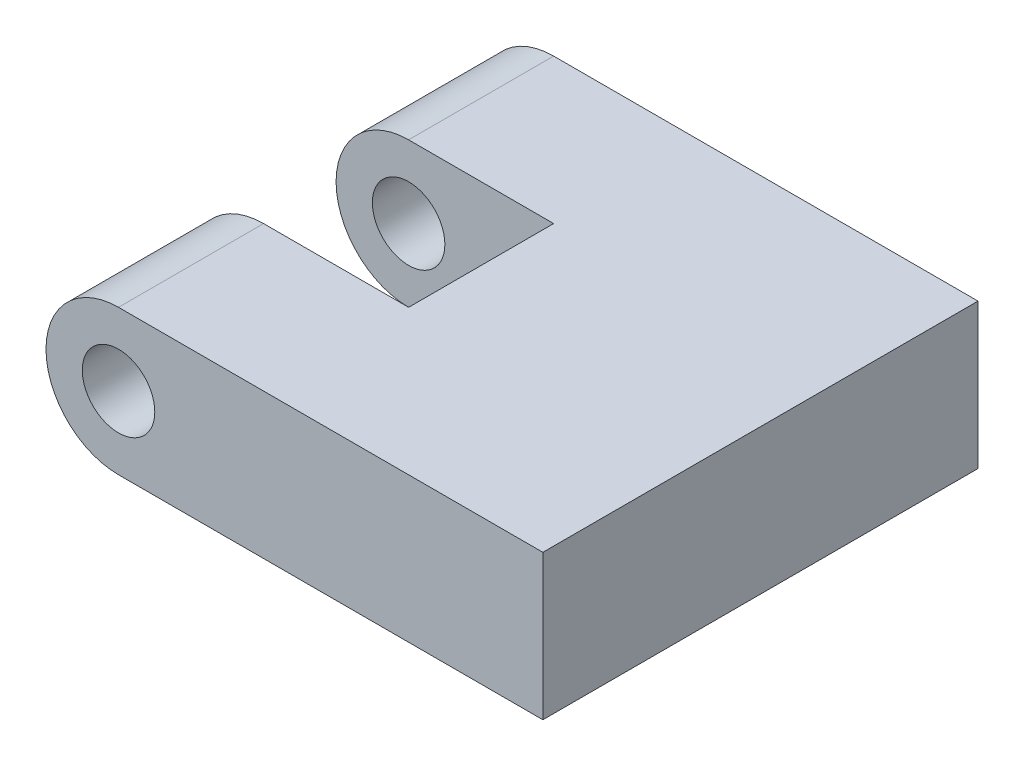
ISO-10303-21;
HEADER;
FILE_DESCRIPTION(('STEP AP214'),'2;1');
FILE_NAME('part.step','',(''),(''),'','','');
FILE_SCHEMA(('AUTOMOTIVE_DESIGN { 1 0 10303 214 1 1 1 1 }'));
ENDSEC;
DATA;
#1=APPLICATION_CONTEXT('core data for automotive mechanical design processes');
#2=APPLICATION_PROTOCOL_DEFINITION('international standard','automotive_design',2000,#1);
#3=PRODUCT_CONTEXT('',#1,'mechanical');
#4=PRODUCT('Part','Part','',(#3));
#5=PRODUCT_RELATED_PRODUCT_CATEGORY('part','',(#4));
#6=PRODUCT_DEFINITION_FORMATION('','',#4);
#7=PRODUCT_DEFINITION_CONTEXT('part definition',#1,'design');
#8=PRODUCT_DEFINITION('design','',#6,#7);
#9=PRODUCT_DEFINITION_SHAPE('','',#8);
#10=(LENGTH_UNIT() NAMED_UNIT(*) SI_UNIT(.MILLI.,.METRE.));
#11=(NAMED_UNIT(*) PLANE_ANGLE_UNIT() SI_UNIT($,.RADIAN.));
#12=(NAMED_UNIT(*) SI_UNIT($,.STERADIAN.) SOLID_ANGLE_UNIT());
#13=UNCERTAINTY_MEASURE_WITH_UNIT(LENGTH_MEASURE(1.E-05),#10,'distance_accuracy_value','');
#14=(GEOMETRIC_REPRESENTATION_CONTEXT(3) GLOBAL_UNCERTAINTY_ASSIGNED_CONTEXT((#13)) GLOBAL_UNIT_ASSIGNED_CONTEXT((#10,
#11,#12)) REPRESENTATION_CONTEXT('',''));
#15=CARTESIAN_POINT('',(0.,0.,0.));
#16=DIRECTION('',(0.,0.,1.));
#17=DIRECTION('',(1.,0.,0.));
#18=AXIS2_PLACEMENT_3D('',#15,#16,#17);
#19=CARTESIAN_POINT('',(0.,10.,60.));
#20=DIRECTION('',(0.,1.,0.));
#21=DIRECTION('',(0.,0.,1.));
#22=AXIS2_PLACEMENT_3D('',#19,#20,#21);
#23=PLANE('',#22);
#24=DIRECTION('',(0.,0.,1.));
#25=VECTOR('',#24,1.);
#26=CARTESIAN_POINT('',(20.,10.,60.));
#27=LINE('',#26,#25);
#28=CARTESIAN_POINT('',(20.,10.,20.));
#29=VERTEX_POINT('',#28);
#30=CARTESIAN_POINT('',(20.,10.,40.));
#31=VERTEX_POINT('',#30);
#32=EDGE_CURVE('E137',#29,#31,#27,.T.);
#33=ORIENTED_EDGE('',*,*,#32,.T.);
#34=DIRECTION('',(-1.,0.,0.));
#35=VECTOR('',#34,1.);
#36=CARTESIAN_POINT('',(0.,10.,40.));
#37=LINE('',#36,#35);
#38=CARTESIAN_POINT('',(0.,10.,40.));
#39=VERTEX_POINT('',#38);
#40=EDGE_CURVE('E134',#31,#39,#37,.T.);
#41=ORIENTED_EDGE('',*,*,#40,.T.);
#42=DIRECTION('',(0.,0.,-1.));
#43=VECTOR('',#42,1.);
#44=CARTESIAN_POINT('',(0.,10.,60.));
#45=LINE('',#44,#43);
#46=CARTESIAN_POINT('',(0.,10.,60.));
#47=VERTEX_POINT('',#46);
#48=EDGE_CURVE('E112',#47,#39,#45,.T.);
#49=ORIENTED_EDGE('',*,*,#48,.F.);
#50=DIRECTION('',(1.,0.,0.));
#51=VECTOR('',#50,1.);
#52=CARTESIAN_POINT('',(0.,10.,60.));
#53=LINE('',#52,#51);
#54=CARTESIAN_POINT('',(58.512258846341,10.,60.));
#55=VERTEX_POINT('',#54);
#56=EDGE_CURVE('E106',#47,#55,#53,.T.);
#57=ORIENTED_EDGE('',*,*,#56,.T.);
#58=DIRECTION('',(0.,0.,1.));
#59=VECTOR('',#58,1.);
#60=CARTESIAN_POINT('',(58.512258846341,10.,0.));
#61=LINE('',#60,#59);
#62=CARTESIAN_POINT('',(58.512258846341,10.,0.));
#63=VERTEX_POINT('',#62);
#64=EDGE_CURVE('E165',#63,#55,#61,.T.);
#65=ORIENTED_EDGE('',*,*,#64,.F.);
#66=DIRECTION('',(1.,0.,0.));
#67=VECTOR('',#66,1.);
#68=CARTESIAN_POINT('',(0.,10.,0.));
#69=LINE('',#68,#67);
#70=CARTESIAN_POINT('',(0.,10.,0.));
#71=VERTEX_POINT('',#70);
#72=EDGE_CURVE('E100',#71,#63,#69,.T.);
#73=ORIENTED_EDGE('',*,*,#72,.F.);
#74=CARTESIAN_POINT('',(0.,10.,20.));
#75=VERTEX_POINT('',#74);
#76=EDGE_CURVE('E96',#75,#71,#45,.T.);
#77=ORIENTED_EDGE('',*,*,#76,.F.);
#78=DIRECTION('',(1.,0.,0.));
#79=VECTOR('',#78,1.);
#80=CARTESIAN_POINT('',(0.,10.,20.));
#81=LINE('',#80,#79);
#82=EDGE_CURVE('E148',#75,#29,#81,.T.);
#83=ORIENTED_EDGE('',*,*,#82,.T.);
#84=EDGE_LOOP('',(#33,#41,#49,#57,#65,#73,#77,#83));
#85=FACE_BOUND('',#84,.T.);
#86=ADVANCED_FACE('F37',(#85),#23,.T.);
#87=CARTESIAN_POINT('',(0.,0.,60.));
#88=DIRECTION('',(0.,0.,-1.));
#89=DIRECTION('',(-1.,0.,0.));
#90=AXIS2_PLACEMENT_3D('',#87,#88,#89);
#91=CYLINDRICAL_SURFACE('',#90,10.);
#92=CARTESIAN_POINT('',(0.,0.,40.));
#93=DIRECTION('',(0.,0.,-1.));
#94=DIRECTION('',(0.,1.,0.));
#95=AXIS2_PLACEMENT_3D('',#92,#93,#94);
#96=CIRCLE('',#95,10.);
#97=CARTESIAN_POINT('',(0.,-10.,40.));
#98=VERTEX_POINT('',#97);
#99=EDGE_CURVE('E151',#98,#39,#96,.T.);
#100=ORIENTED_EDGE('',*,*,#99,.F.);
#101=DIRECTION('',(0.,0.,-1.));
#102=VECTOR('',#101,1.);
#103=CARTESIAN_POINT('',(0.,-10.,60.));
#104=LINE('',#103,#102);
#105=CARTESIAN_POINT('',(0.,-10.,60.));
#106=VERTEX_POINT('',#105);
#107=EDGE_CURVE('E89',#106,#98,#104,.T.);
#108=ORIENTED_EDGE('',*,*,#107,.F.);
#109=CARTESIAN_POINT('',(0.,0.,60.));
#110=DIRECTION('',(0.,0.,1.));
#111=DIRECTION('',(1.,0.,0.));
#112=AXIS2_PLACEMENT_3D('',#109,#110,#111);
#113=CIRCLE('',#112,10.);
#114=EDGE_CURVE('E61',#47,#106,#113,.T.);
#115=ORIENTED_EDGE('',*,*,#114,.F.);
#116=ORIENTED_EDGE('',*,*,#48,.T.);
#117=EDGE_LOOP('',(#100,#108,#115,#116));
#118=FACE_BOUND('',#117,.T.);
#119=ADVANCED_FACE('F197',(#118),#91,.T.);
#120=CARTESIAN_POINT('',(0.,0.,20.));
#121=DIRECTION('',(0.,0.,1.));
#122=DIRECTION('',(0.,-1.,0.));
#123=AXIS2_PLACEMENT_3D('',#120,#121,#122);
#124=CIRCLE('',#123,10.);
#125=CARTESIAN_POINT('',(0.,-10.,20.));
#126=VERTEX_POINT('',#125);
#127=EDGE_CURVE('E145',#75,#126,#124,.T.);
#128=ORIENTED_EDGE('',*,*,#127,.F.);
#129=ORIENTED_EDGE('',*,*,#76,.T.);
#130=CARTESIAN_POINT('',(0.,0.,0.));
#131=DIRECTION('',(0.,0.,1.));
#132=DIRECTION('',(1.,0.,0.));
#133=AXIS2_PLACEMENT_3D('',#130,#131,#132);
#134=CIRCLE('',#133,10.);
#135=CARTESIAN_POINT('',(0.,-10.,0.));
#136=VERTEX_POINT('',#135);
#137=EDGE_CURVE('E93',#71,#136,#134,.T.);
#138=ORIENTED_EDGE('',*,*,#137,.T.);
#139=EDGE_CURVE('E76',#126,#136,#104,.T.);
#140=ORIENTED_EDGE('',*,*,#139,.F.);
#141=EDGE_LOOP('',(#128,#129,#138,#140));
#142=FACE_BOUND('',#141,.T.);
#143=ADVANCED_FACE('F94',(#142),#91,.T.);
#144=CARTESIAN_POINT('',(0.,-10.,60.));
#145=DIRECTION('',(0.,-1.,0.));
#146=DIRECTION('',(0.,0.,-1.));
#147=AXIS2_PLACEMENT_3D('',#144,#145,#146);
#148=PLANE('',#147);
#149=ORIENTED_EDGE('',*,*,#107,.T.);
#150=DIRECTION('',(1.,0.,0.));
#151=VECTOR('',#150,1.);
#152=CARTESIAN_POINT('',(0.,-10.,40.));
#153=LINE('',#152,#151);
#154=CARTESIAN_POINT('',(20.,-9.99999999999999,40.));
#155=VERTEX_POINT('',#154);
#156=EDGE_CURVE('E11',#98,#155,#153,.T.);
#157=ORIENTED_EDGE('',*,*,#156,.T.);
#158=DIRECTION('',(0.,0.,-1.));
#159=VECTOR('',#158,1.);
#160=CARTESIAN_POINT('',(20.,-10.,60.));
#161=LINE('',#160,#159);
#162=CARTESIAN_POINT('',(20.,-10.,20.));
#163=VERTEX_POINT('',#162);
#164=EDGE_CURVE('E115',#155,#163,#161,.T.);
#165=ORIENTED_EDGE('',*,*,#164,.T.);
#166=DIRECTION('',(-1.,0.,0.));
#167=VECTOR('',#166,1.);
#168=CARTESIAN_POINT('',(0.,-10.,20.));
#169=LINE('',#168,#167);
#170=EDGE_CURVE('E45',#163,#126,#169,.T.);
#171=ORIENTED_EDGE('',*,*,#170,.T.);
#172=ORIENTED_EDGE('',*,*,#139,.T.);
#173=DIRECTION('',(-1.,0.,0.));
#174=VECTOR('',#173,1.);
#175=CARTESIAN_POINT('',(0.,-10.,0.));
#176=LINE('',#175,#174);
#177=CARTESIAN_POINT('',(58.512258846341,-10.,0.));
#178=VERTEX_POINT('',#177);
#179=EDGE_CURVE('E83',#178,#136,#176,.T.);
#180=ORIENTED_EDGE('',*,*,#179,.F.);
#181=DIRECTION('',(0.,0.,-1.));
#182=VECTOR('',#181,1.);
#183=CARTESIAN_POINT('',(58.512258846341,-10.,60.));
#184=LINE('',#183,#182);
#185=CARTESIAN_POINT('',(58.512258846341,-10.,60.));
#186=VERTEX_POINT('',#185);
#187=EDGE_CURVE('E167',#186,#178,#184,.T.);
#188=ORIENTED_EDGE('',*,*,#187,.F.);
#189=DIRECTION('',(-1.,0.,0.));
#190=VECTOR('',#189,1.);
#191=CARTESIAN_POINT('',(0.,-10.,60.));
#192=LINE('',#191,#190);
#193=EDGE_CURVE('E90',#186,#106,#192,.T.);
#194=ORIENTED_EDGE('',*,*,#193,.T.);
#195=EDGE_LOOP('',(#149,#157,#165,#171,#172,#180,#188,#194));
#196=FACE_BOUND('',#195,.T.);
#197=ADVANCED_FACE('F79',(#196),#148,.T.);
#198=CARTESIAN_POINT('',(0.,0.,60.));
#199=DIRECTION('',(0.,0.,1.));
#200=DIRECTION('',(1.,0.,0.));
#201=AXIS2_PLACEMENT_3D('',#198,#199,#200);
#202=PLANE('',#201);
#203=CARTESIAN_POINT('',(0.,0.,60.));
#204=DIRECTION('',(0.,0.,1.));
#205=DIRECTION('',(1.,0.,0.));
#206=AXIS2_PLACEMENT_3D('',#203,#204,#205);
#207=CIRCLE('',#206,5.);
#208=CARTESIAN_POINT('',(5.,0.,60.));
#209=VERTEX_POINT('',#208);
#210=EDGE_CURVE('E171',#209,#209,#207,.T.);
#211=ORIENTED_EDGE('',*,*,#210,.F.);
#212=EDGE_LOOP('',(#211));
#213=FACE_BOUND('',#212,.T.);
#214=ORIENTED_EDGE('',*,*,#56,.F.);
#215=ORIENTED_EDGE('',*,*,#114,.T.);
#216=ORIENTED_EDGE('',*,*,#193,.F.);
#217=DIRECTION('',(0.,-1.,0.));
#218=VECTOR('',#217,1.);
#219=CARTESIAN_POINT('',(58.512258846341,10.,60.));
#220=LINE('',#219,#218);
#221=EDGE_CURVE('E169',#55,#186,#220,.T.);
#222=ORIENTED_EDGE('',*,*,#221,.F.);
#223=EDGE_LOOP('',(#214,#215,#216,#222));
#224=FACE_BOUND('',#223,.T.);
#225=ADVANCED_FACE('F198',(#213,#224),#202,.T.);
#226=CARTESIAN_POINT('',(0.,0.,0.));
#227=DIRECTION('',(0.,0.,1.));
#228=DIRECTION('',(1.,0.,0.));
#229=AXIS2_PLACEMENT_3D('',#226,#227,#228);
#230=PLANE('',#229);
#231=CARTESIAN_POINT('',(0.,0.,0.));
#232=DIRECTION('',(0.,0.,1.));
#233=DIRECTION('',(1.,0.,0.));
#234=AXIS2_PLACEMENT_3D('',#231,#232,#233);
#235=CIRCLE('',#234,5.);
#236=CARTESIAN_POINT('',(5.,0.,0.));
#237=VERTEX_POINT('',#236);
#238=EDGE_CURVE('E135',#237,#237,#235,.T.);
#239=ORIENTED_EDGE('',*,*,#238,.T.);
#240=EDGE_LOOP('',(#239));
#241=FACE_BOUND('',#240,.T.);
#242=ORIENTED_EDGE('',*,*,#72,.T.);
#243=DIRECTION('',(0.,1.,0.));
#244=VECTOR('',#243,1.);
#245=CARTESIAN_POINT('',(58.512258846341,-10.,0.));
#246=LINE('',#245,#244);
#247=EDGE_CURVE('E104',#178,#63,#246,.T.);
#248=ORIENTED_EDGE('',*,*,#247,.F.);
#249=ORIENTED_EDGE('',*,*,#179,.T.);
#250=ORIENTED_EDGE('',*,*,#137,.F.);
#251=EDGE_LOOP('',(#242,#248,#249,#250));
#252=FACE_BOUND('',#251,.T.);
#253=ADVANCED_FACE('F102',(#241,#252),#230,.F.);
#254=CARTESIAN_POINT('',(20.,14.4723911812518,40.));
#255=DIRECTION('',(0.,0.,-1.));
#256=DIRECTION('',(0.,1.,0.));
#257=AXIS2_PLACEMENT_3D('',#254,#255,#256);
#258=PLANE('',#257);
#259=CARTESIAN_POINT('',(0.,0.,40.));
#260=DIRECTION('',(0.,0.,-1.));
#261=DIRECTION('',(0.,1.,0.));
#262=AXIS2_PLACEMENT_3D('',#259,#260,#261);
#263=CIRCLE('',#262,5.);
#264=CARTESIAN_POINT('',(5.,0.,40.));
#265=VERTEX_POINT('',#264);
#266=EDGE_CURVE('E140',#265,#265,#263,.T.);
#267=ORIENTED_EDGE('',*,*,#266,.F.);
#268=EDGE_LOOP('',(#267));
#269=FACE_BOUND('',#268,.T.);
#270=DIRECTION('',(0.,-1.,0.));
#271=VECTOR('',#270,1.);
#272=CARTESIAN_POINT('',(20.,14.4723911812518,40.));
#273=LINE('',#272,#271);
#274=EDGE_CURVE('E123',#31,#155,#273,.T.);
#275=ORIENTED_EDGE('',*,*,#274,.T.);
#276=ORIENTED_EDGE('',*,*,#156,.F.);
#277=ORIENTED_EDGE('',*,*,#99,.T.);
#278=ORIENTED_EDGE('',*,*,#40,.F.);
#279=EDGE_LOOP('',(#275,#276,#277,#278));
#280=FACE_BOUND('',#279,.T.);
#281=ADVANCED_FACE('F129',(#269,#280),#258,.T.);
#282=CARTESIAN_POINT('',(20.,14.4723911812518,20.));
#283=DIRECTION('',(0.,0.,1.));
#284=DIRECTION('',(0.,-1.,0.));
#285=AXIS2_PLACEMENT_3D('',#282,#283,#284);
#286=PLANE('',#285);
#287=CARTESIAN_POINT('',(0.,0.,20.));
#288=DIRECTION('',(0.,0.,1.));
#289=DIRECTION('',(0.,-1.,0.));
#290=AXIS2_PLACEMENT_3D('',#287,#288,#289);
#291=CIRCLE('',#290,5.);
#292=CARTESIAN_POINT('',(5.,0.,20.));
#293=VERTEX_POINT('',#292);
#294=EDGE_CURVE('E40',#293,#293,#291,.T.);
#295=ORIENTED_EDGE('',*,*,#294,.F.);
#296=EDGE_LOOP('',(#295));
#297=FACE_BOUND('',#296,.T.);
#298=ORIENTED_EDGE('',*,*,#127,.T.);
#299=ORIENTED_EDGE('',*,*,#170,.F.);
#300=DIRECTION('',(0.,1.,0.));
#301=VECTOR('',#300,1.);
#302=CARTESIAN_POINT('',(20.,14.4723911812518,20.));
#303=LINE('',#302,#301);
#304=EDGE_CURVE('E52',#163,#29,#303,.T.);
#305=ORIENTED_EDGE('',*,*,#304,.T.);
#306=ORIENTED_EDGE('',*,*,#82,.F.);
#307=EDGE_LOOP('',(#298,#299,#305,#306));
#308=FACE_BOUND('',#307,.T.);
#309=ADVANCED_FACE('F185',(#297,#308),#286,.T.);
#310=CARTESIAN_POINT('',(20.,0.,0.));
#311=DIRECTION('',(-1.,0.,0.));
#312=DIRECTION('',(0.,0.,1.));
#313=AXIS2_PLACEMENT_3D('',#310,#311,#312);
#314=PLANE('',#313);
#315=ORIENTED_EDGE('',*,*,#304,.F.);
#316=ORIENTED_EDGE('',*,*,#164,.F.);
#317=ORIENTED_EDGE('',*,*,#274,.F.);
#318=ORIENTED_EDGE('',*,*,#32,.F.);
#319=EDGE_LOOP('',(#315,#316,#317,#318));
#320=FACE_BOUND('',#319,.T.);
#321=ADVANCED_FACE('F121',(#320),#314,.T.);
#322=CARTESIAN_POINT('',(0.,0.,-60.));
#323=DIRECTION('',(0.,0.,1.));
#324=DIRECTION('',(1.,0.,0.));
#325=AXIS2_PLACEMENT_3D('',#322,#323,#324);
#326=CYLINDRICAL_SURFACE('',#325,5.);
#327=CARTESIAN_POINT('',(5.,0.,20.));
#328=CARTESIAN_POINT('',(5.,0.,19.7916666666667));
#329=CARTESIAN_POINT('',(5.,0.,19.5833333333333));
#330=CARTESIAN_POINT('',(5.,0.,19.1666666666667));
#331=CARTESIAN_POINT('',(5.,0.,18.9583333333333));
#332=CARTESIAN_POINT('',(5.,0.,18.5416666666667));
#333=CARTESIAN_POINT('',(5.,0.,18.3333333333333));
#334=CARTESIAN_POINT('',(5.,0.,17.9166666666667));
#335=CARTESIAN_POINT('',(5.,0.,17.7083333333333));
#336=CARTESIAN_POINT('',(5.,0.,17.2916666666667));
#337=CARTESIAN_POINT('',(5.,0.,17.0833333333333));
#338=CARTESIAN_POINT('',(5.,0.,16.6666666666667));
#339=CARTESIAN_POINT('',(5.,0.,16.4583333333333));
#340=CARTESIAN_POINT('',(5.,0.,16.0416666666667));
#341=CARTESIAN_POINT('',(5.,0.,15.8333333333333));
#342=CARTESIAN_POINT('',(5.,0.,15.4166666666667));
#343=CARTESIAN_POINT('',(5.,0.,15.2083333333333));
#344=CARTESIAN_POINT('',(5.,0.,14.7916666666667));
#345=CARTESIAN_POINT('',(5.,0.,14.5833333333333));
#346=CARTESIAN_POINT('',(5.,0.,14.1666666666667));
#347=CARTESIAN_POINT('',(5.,0.,13.9583333333333));
#348=CARTESIAN_POINT('',(5.,0.,13.5416666666667));
#349=CARTESIAN_POINT('',(5.,0.,13.3333333333333));
#350=CARTESIAN_POINT('',(5.,0.,12.9166666666667));
#351=CARTESIAN_POINT('',(5.,0.,12.7083333333333));
#352=CARTESIAN_POINT('',(5.,0.,12.2916666666667));
#353=CARTESIAN_POINT('',(5.,0.,12.0833333333333));
#354=CARTESIAN_POINT('',(5.,0.,11.6666666666667));
#355=CARTESIAN_POINT('',(5.,0.,11.4583333333333));
#356=CARTESIAN_POINT('',(5.,0.,11.0416666666667));
#357=CARTESIAN_POINT('',(5.,0.,10.8333333333333));
#358=CARTESIAN_POINT('',(5.,0.,10.4166666666667));
#359=CARTESIAN_POINT('',(5.,0.,10.2083333333333));
#360=CARTESIAN_POINT('',(5.,0.,9.79166666666666));
#361=CARTESIAN_POINT('',(5.,0.,9.58333333333333));
#362=CARTESIAN_POINT('',(5.,0.,9.16666666666666));
#363=CARTESIAN_POINT('',(5.,0.,8.95833333333333));
#364=CARTESIAN_POINT('',(5.,0.,8.54166666666666));
#365=CARTESIAN_POINT('',(5.,0.,8.33333333333333));
#366=CARTESIAN_POINT('',(5.,0.,7.91666666666667));
#367=CARTESIAN_POINT('',(5.,0.,7.70833333333333));
#368=CARTESIAN_POINT('',(5.,0.,7.29166666666667));
#369=CARTESIAN_POINT('',(5.,0.,7.08333333333333));
#370=CARTESIAN_POINT('',(5.,0.,6.66666666666667));
#371=CARTESIAN_POINT('',(5.,0.,6.45833333333333));
#372=CARTESIAN_POINT('',(5.,0.,6.04166666666667));
#373=CARTESIAN_POINT('',(5.,0.,5.83333333333333));
#374=CARTESIAN_POINT('',(5.,0.,5.41666666666666));
#375=CARTESIAN_POINT('',(5.,0.,5.20833333333333));
#376=CARTESIAN_POINT('',(5.,0.,4.79166666666666));
#377=CARTESIAN_POINT('',(5.,0.,4.58333333333333));
#378=CARTESIAN_POINT('',(5.,0.,4.16666666666666));
#379=CARTESIAN_POINT('',(5.,0.,3.95833333333333));
#380=CARTESIAN_POINT('',(5.,0.,3.54166666666666));
#381=CARTESIAN_POINT('',(5.,0.,3.33333333333333));
#382=CARTESIAN_POINT('',(5.,0.,2.91666666666666));
#383=CARTESIAN_POINT('',(5.,0.,2.70833333333333));
#384=CARTESIAN_POINT('',(5.,0.,2.29166666666667));
#385=CARTESIAN_POINT('',(5.,0.,2.08333333333334));
#386=CARTESIAN_POINT('',(5.,0.,1.66666666666667));
#387=CARTESIAN_POINT('',(5.,0.,1.45833333333333));
#388=CARTESIAN_POINT('',(5.,0.,1.04166666666667));
#389=CARTESIAN_POINT('',(5.,0.,0.833333333333334));
#390=CARTESIAN_POINT('',(5.,0.,0.416666666666667));
#391=CARTESIAN_POINT('',(5.,0.,0.208333333333334));
#392=CARTESIAN_POINT('',(5.,0.,0.));
#393=B_SPLINE_CURVE_WITH_KNOTS('',3,(#327,#328,#329,#330,#331,#332,#333,#334,#335,#336,#337,
#338,#339,#340,#341,#342,#343,#344,#345,#346,#347,#348,#349,#350,#351,#352,#353,#354,#355,#356,
#357,#358,#359,#360,#361,#362,#363,#364,#365,#366,#367,#368,#369,#370,#371,#372,#373,#374,#375,
#376,#377,#378,#379,#380,#381,#382,#383,#384,#385,#386,#387,#388,#389,#390,#391,#392),
.UNSPECIFIED.,.F.,.F.,(4,2,2,2,2,2,2,2,2,2,2,2,2,2,2,2,2,2,2,2,2,2,2,2,2,2,2,2,2,2,2,2,4),(0.,
0.625000000000001,1.25,1.875,2.5,3.125,3.75,4.375,5.,5.62500000000001,6.25000000000001,
6.87500000000001,7.50000000000001,8.12500000000001,8.75000000000001,9.37499999999999,10.,10.625,
11.25,11.875,12.5,13.125,13.75,14.375,15.,15.625,16.25,16.875,17.5,18.125,18.75,19.375,20.),.UNSPECIFIED.);
#394=EDGE_CURVE('BSEAM182',#293,#237,#393,.T.);
#395=ORIENTED_EDGE('',*,*,#294,.T.);
#396=ORIENTED_EDGE('',*,*,#238,.F.);
#397=ORIENTED_EDGE('',*,*,#394,.T.);
#398=ORIENTED_EDGE('',*,*,#394,.F.);
#399=EDGE_LOOP('',(#395,#397,#396,#398));
#400=FACE_BOUND('',#399,.T.);
#401=ADVANCED_FACE('F182',(#400),#326,.F.);
#402=CARTESIAN_POINT('',(5.,0.,40.));
#403=CARTESIAN_POINT('',(5.,0.,40.2083333333333));
#404=CARTESIAN_POINT('',(5.,0.,40.4166666666667));
#405=CARTESIAN_POINT('',(5.,0.,40.8333333333333));
#406=CARTESIAN_POINT('',(5.,0.,41.0416666666667));
#407=CARTESIAN_POINT('',(5.,0.,41.4583333333333));
#408=CARTESIAN_POINT('',(5.,0.,41.6666666666667));
#409=CARTESIAN_POINT('',(5.,0.,42.0833333333333));
#410=CARTESIAN_POINT('',(5.,0.,42.2916666666667));
#411=CARTESIAN_POINT('',(5.,0.,42.7083333333333));
#412=CARTESIAN_POINT('',(5.,0.,42.9166666666667));
#413=CARTESIAN_POINT('',(5.,0.,43.3333333333333));
#414=CARTESIAN_POINT('',(5.,0.,43.5416666666667));
#415=CARTESIAN_POINT('',(5.,0.,43.9583333333333));
#416=CARTESIAN_POINT('',(5.,0.,44.1666666666667));
#417=CARTESIAN_POINT('',(5.,0.,44.5833333333333));
#418=CARTESIAN_POINT('',(5.,0.,44.7916666666667));
#419=CARTESIAN_POINT('',(5.,0.,45.2083333333333));
#420=CARTESIAN_POINT('',(5.,0.,45.4166666666667));
#421=CARTESIAN_POINT('',(5.,0.,45.8333333333333));
#422=CARTESIAN_POINT('',(5.,0.,46.0416666666667));
#423=CARTESIAN_POINT('',(5.,0.,46.4583333333333));
#424=CARTESIAN_POINT('',(5.,0.,46.6666666666667));
#425=CARTESIAN_POINT('',(5.,0.,47.0833333333333));
#426=CARTESIAN_POINT('',(5.,0.,47.2916666666667));
#427=CARTESIAN_POINT('',(5.,0.,47.7083333333333));
#428=CARTESIAN_POINT('',(5.,0.,47.9166666666667));
#429=CARTESIAN_POINT('',(5.,0.,48.3333333333333));
#430=CARTESIAN_POINT('',(5.,0.,48.5416666666667));
#431=CARTESIAN_POINT('',(5.,0.,48.9583333333333));
#432=CARTESIAN_POINT('',(5.,0.,49.1666666666667));
#433=CARTESIAN_POINT('',(5.,0.,49.5833333333333));
#434=CARTESIAN_POINT('',(5.,0.,49.7916666666667));
#435=CARTESIAN_POINT('',(5.,0.,50.2083333333333));
#436=CARTESIAN_POINT('',(5.,0.,50.4166666666667));
#437=CARTESIAN_POINT('',(5.,0.,50.8333333333333));
#438=CARTESIAN_POINT('',(5.,0.,51.0416666666667));
#439=CARTESIAN_POINT('',(5.,0.,51.4583333333333));
#440=CARTESIAN_POINT('',(5.,0.,51.6666666666667));
#441=CARTESIAN_POINT('',(5.,0.,52.0833333333333));
#442=CARTESIAN_POINT('',(5.,0.,52.2916666666667));
#443=CARTESIAN_POINT('',(5.,0.,52.7083333333333));
#444=CARTESIAN_POINT('',(5.,0.,52.9166666666667));
#445=CARTESIAN_POINT('',(5.,0.,53.3333333333333));
#446=CARTESIAN_POINT('',(5.,0.,53.5416666666667));
#447=CARTESIAN_POINT('',(5.,0.,53.9583333333333));
#448=CARTESIAN_POINT('',(5.,0.,54.1666666666667));
#449=CARTESIAN_POINT('',(5.,0.,54.5833333333333));
#450=CARTESIAN_POINT('',(5.,0.,54.7916666666667));
#451=CARTESIAN_POINT('',(5.,0.,55.2083333333333));
#452=CARTESIAN_POINT('',(5.,0.,55.4166666666667));
#453=CARTESIAN_POINT('',(5.,0.,55.8333333333333));
#454=CARTESIAN_POINT('',(5.,0.,56.0416666666667));
#455=CARTESIAN_POINT('',(5.,0.,56.4583333333333));
#456=CARTESIAN_POINT('',(5.,0.,56.6666666666667));
#457=CARTESIAN_POINT('',(5.,0.,57.0833333333333));
#458=CARTESIAN_POINT('',(5.,0.,57.2916666666667));
#459=CARTESIAN_POINT('',(5.,0.,57.7083333333333));
#460=CARTESIAN_POINT('',(5.,0.,57.9166666666667));
#461=CARTESIAN_POINT('',(5.,0.,58.3333333333333));
#462=CARTESIAN_POINT('',(5.,0.,58.5416666666667));
#463=CARTESIAN_POINT('',(5.,0.,58.9583333333333));
#464=CARTESIAN_POINT('',(5.,0.,59.1666666666667));
#465=CARTESIAN_POINT('',(5.,0.,59.5833333333333));
#466=CARTESIAN_POINT('',(5.,0.,59.7916666666667));
#467=CARTESIAN_POINT('',(5.,0.,60.));
#468=B_SPLINE_CURVE_WITH_KNOTS('',3,(#402,#403,#404,#405,#406,#407,#408,#409,#410,#411,#412,
#413,#414,#415,#416,#417,#418,#419,#420,#421,#422,#423,#424,#425,#426,#427,#428,#429,#430,#431,
#432,#433,#434,#435,#436,#437,#438,#439,#440,#441,#442,#443,#444,#445,#446,#447,#448,#449,#450,
#451,#452,#453,#454,#455,#456,#457,#458,#459,#460,#461,#462,#463,#464,#465,#466,#467),
.UNSPECIFIED.,.F.,.F.,(4,2,2,2,2,2,2,2,2,2,2,2,2,2,2,2,2,2,2,2,2,2,2,2,2,2,2,2,2,2,2,2,4),(0.,
0.625000000000001,1.25,1.875,2.5,3.125,3.75,4.375,5.,5.62499999999999,6.24999999999999,
6.87499999999999,7.49999999999999,8.12499999999999,8.74999999999999,9.37499999999999,
9.99999999999999,10.625,11.25,11.875,12.5,13.125,13.75,14.375,15.,15.625,16.25,16.875,17.5,
18.125,18.75,19.375,20.),.UNSPECIFIED.);
#469=EDGE_CURVE('BSEAM254',#265,#209,#468,.T.);
#470=ORIENTED_EDGE('',*,*,#266,.T.);
#471=ORIENTED_EDGE('',*,*,#210,.T.);
#472=ORIENTED_EDGE('',*,*,#469,.T.);
#473=ORIENTED_EDGE('',*,*,#469,.F.);
#474=EDGE_LOOP('',(#470,#472,#471,#473));
#475=FACE_BOUND('',#474,.T.);
#476=ADVANCED_FACE('F254',(#475),#326,.F.);
#477=CARTESIAN_POINT('',(58.512258846341,0.,0.));
#478=DIRECTION('',(1.,0.,0.));
#479=DIRECTION('',(0.,0.,-1.));
#480=AXIS2_PLACEMENT_3D('',#477,#478,#479);
#481=PLANE('',#480);
#482=ORIENTED_EDGE('',*,*,#187,.T.);
#483=ORIENTED_EDGE('',*,*,#247,.T.);
#484=ORIENTED_EDGE('',*,*,#64,.T.);
#485=ORIENTED_EDGE('',*,*,#221,.T.);
#486=EDGE_LOOP('',(#482,#483,#484,#485));
#487=FACE_BOUND('',#486,.T.);
#488=ADVANCED_FACE('F163',(#487),#481,.T.);
#489=CLOSED_SHELL('',(#86,#119,#143,#197,#225,#253,#281,#309,#321,#401,#476,#488));
#490=MANIFOLD_SOLID_BREP('B2',#489);
#491=ADVANCED_BREP_SHAPE_REPRESENTATION('',(#18,#490),#14);
#492=SHAPE_DEFINITION_REPRESENTATION(#9,#491);
ENDSEC;
END-ISO-10303-21;
